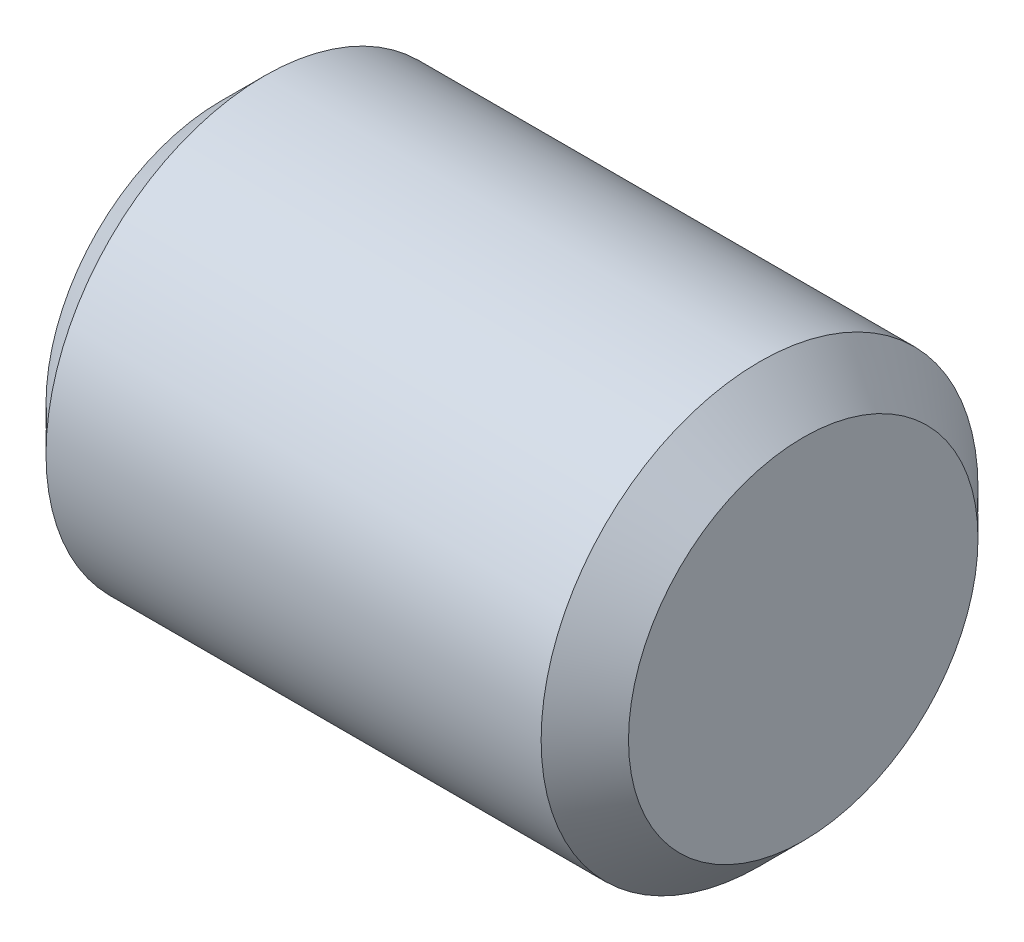
ISO-10303-21;
HEADER;
FILE_DESCRIPTION(('STEP AP214'),'2;1');
FILE_NAME('part.step','',(''),(''),'','','');
FILE_SCHEMA(('AUTOMOTIVE_DESIGN { 1 0 10303 214 1 1 1 1 }'));
ENDSEC;
DATA;
#1=APPLICATION_CONTEXT('core data for automotive mechanical design processes');
#2=APPLICATION_PROTOCOL_DEFINITION('international standard','automotive_design',2000,#1);
#3=PRODUCT_CONTEXT('',#1,'mechanical');
#4=PRODUCT('Part','Part','',(#3));
#5=PRODUCT_RELATED_PRODUCT_CATEGORY('part','',(#4));
#6=PRODUCT_DEFINITION_FORMATION('','',#4);
#7=PRODUCT_DEFINITION_CONTEXT('part definition',#1,'design');
#8=PRODUCT_DEFINITION('design','',#6,#7);
#9=PRODUCT_DEFINITION_SHAPE('','',#8);
#10=(LENGTH_UNIT() NAMED_UNIT(*) SI_UNIT(.MILLI.,.METRE.));
#11=(NAMED_UNIT(*) PLANE_ANGLE_UNIT() SI_UNIT($,.RADIAN.));
#12=(NAMED_UNIT(*) SI_UNIT($,.STERADIAN.) SOLID_ANGLE_UNIT());
#13=UNCERTAINTY_MEASURE_WITH_UNIT(LENGTH_MEASURE(1.E-05),#10,'distance_accuracy_value','');
#14=(GEOMETRIC_REPRESENTATION_CONTEXT(3) GLOBAL_UNCERTAINTY_ASSIGNED_CONTEXT((#13)) GLOBAL_UNIT_ASSIGNED_CONTEXT((#10,
#11,#12)) REPRESENTATION_CONTEXT('',''));
#15=CARTESIAN_POINT('',(0.,0.,0.));
#16=DIRECTION('',(0.,0.,1.));
#17=DIRECTION('',(1.,0.,0.));
#18=AXIS2_PLACEMENT_3D('',#15,#16,#17);
#19=CARTESIAN_POINT('',(-3.175,0.,0.));
#20=DIRECTION('',(1.,0.,0.));
#21=DIRECTION('',(0.,0.,-1.));
#22=AXIS2_PLACEMENT_3D('',#19,#20,#21);
#23=CYLINDRICAL_SURFACE('',#22,2.38125);
#24=CARTESIAN_POINT('',(2.69875,0.,0.));
#25=DIRECTION('',(1.,0.,0.));
#26=DIRECTION('',(0.,0.,-1.));
#27=AXIS2_PLACEMENT_3D('',#24,#25,#26);
#28=CIRCLE('',#27,2.38125);
#29=CARTESIAN_POINT('',(2.69875,0.,2.38125));
#30=VERTEX_POINT('',#29);
#31=EDGE_CURVE('E37',#30,#30,#28,.F.);
#32=ORIENTED_EDGE('',*,*,#31,.T.);
#33=EDGE_LOOP('',(#32));
#34=FACE_BOUND('',#33,.T.);
#35=CARTESIAN_POINT('',(-2.69875,0.,0.));
#36=DIRECTION('',(1.,0.,0.));
#37=DIRECTION('',(0.,0.,-1.));
#38=AXIS2_PLACEMENT_3D('',#35,#36,#37);
#39=CIRCLE('',#38,2.38125);
#40=CARTESIAN_POINT('',(-2.69875,0.,-2.38125));
#41=VERTEX_POINT('',#40);
#42=EDGE_CURVE('E41',#41,#41,#39,.T.);
#43=ORIENTED_EDGE('',*,*,#42,.T.);
#44=EDGE_LOOP('',(#43));
#45=FACE_BOUND('',#44,.T.);
#46=ADVANCED_FACE('F30',(#34,#45),#23,.T.);
#47=CARTESIAN_POINT('',(-3.175,0.,0.));
#48=DIRECTION('',(1.,0.,0.));
#49=DIRECTION('',(0.,0.,-1.));
#50=AXIS2_PLACEMENT_3D('',#47,#48,#49);
#51=PLANE('',#50);
#52=CARTESIAN_POINT('',(-3.175,0.,0.));
#53=DIRECTION('',(1.,0.,0.));
#54=DIRECTION('',(0.,0.,-1.));
#55=AXIS2_PLACEMENT_3D('',#52,#53,#54);
#56=CIRCLE('',#55,1.905);
#57=CARTESIAN_POINT('',(-3.175,0.,-1.905));
#58=VERTEX_POINT('',#57);
#59=EDGE_CURVE('E10',#58,#58,#56,.F.);
#60=ORIENTED_EDGE('',*,*,#59,.T.);
#61=EDGE_LOOP('',(#60));
#62=FACE_BOUND('',#61,.T.);
#63=ADVANCED_FACE('F61',(#62),#51,.F.);
#64=CARTESIAN_POINT('',(3.175,0.,0.));
#65=DIRECTION('',(1.,0.,0.));
#66=DIRECTION('',(0.,0.,-1.));
#67=AXIS2_PLACEMENT_3D('',#64,#65,#66);
#68=PLANE('',#67);
#69=CARTESIAN_POINT('',(3.175,0.,0.));
#70=DIRECTION('',(1.,0.,0.));
#71=DIRECTION('',(0.,0.,-1.));
#72=AXIS2_PLACEMENT_3D('',#69,#70,#71);
#73=CIRCLE('',#72,1.905);
#74=CARTESIAN_POINT('',(3.175,0.,1.905));
#75=VERTEX_POINT('',#74);
#76=EDGE_CURVE('E45',#75,#75,#73,.T.);
#77=ORIENTED_EDGE('',*,*,#76,.T.);
#78=EDGE_LOOP('',(#77));
#79=FACE_BOUND('',#78,.T.);
#80=ADVANCED_FACE('F51',(#79),#68,.T.);
#81=CARTESIAN_POINT('',(3.175,0.,0.));
#82=DIRECTION('',(-1.,0.,0.));
#83=DIRECTION('',(0.,0.,1.));
#84=AXIS2_PLACEMENT_3D('',#81,#82,#83);
#85=CONICAL_SURFACE('',#84,1.905,0.785398163397447);
#86=CARTESIAN_POINT('',(2.69875,0.,2.38125));
#87=CARTESIAN_POINT('',(2.7037109375,0.,2.3762890625));
#88=CARTESIAN_POINT('',(2.708671875,0.,2.371328125));
#89=CARTESIAN_POINT('',(2.71859375,0.,2.36140625));
#90=CARTESIAN_POINT('',(2.7235546875,0.,2.3564453125));
#91=CARTESIAN_POINT('',(2.7334765625,0.,2.3465234375));
#92=CARTESIAN_POINT('',(2.7384375,0.,2.3415625));
#93=CARTESIAN_POINT('',(2.748359375,0.,2.331640625));
#94=CARTESIAN_POINT('',(2.7533203125,0.,2.3266796875));
#95=CARTESIAN_POINT('',(2.7632421875,0.,2.3167578125));
#96=CARTESIAN_POINT('',(2.768203125,0.,2.311796875));
#97=CARTESIAN_POINT('',(2.778125,0.,2.301875));
#98=CARTESIAN_POINT('',(2.7830859375,0.,2.2969140625));
#99=CARTESIAN_POINT('',(2.7930078125,0.,2.2869921875));
#100=CARTESIAN_POINT('',(2.79796875,0.,2.28203125));
#101=CARTESIAN_POINT('',(2.807890625,0.,2.272109375));
#102=CARTESIAN_POINT('',(2.8128515625,0.,2.2671484375));
#103=CARTESIAN_POINT('',(2.8227734375,0.,2.2572265625));
#104=CARTESIAN_POINT('',(2.827734375,0.,2.252265625));
#105=CARTESIAN_POINT('',(2.83765625,0.,2.24234375));
#106=CARTESIAN_POINT('',(2.8426171875,0.,2.2373828125));
#107=CARTESIAN_POINT('',(2.8525390625,0.,2.2274609375));
#108=CARTESIAN_POINT('',(2.8575,0.,2.2225));
#109=CARTESIAN_POINT('',(2.867421875,0.,2.212578125));
#110=CARTESIAN_POINT('',(2.8723828125,0.,2.2076171875));
#111=CARTESIAN_POINT('',(2.8823046875,0.,2.1976953125));
#112=CARTESIAN_POINT('',(2.887265625,0.,2.192734375));
#113=CARTESIAN_POINT('',(2.8971875,0.,2.1828125));
#114=CARTESIAN_POINT('',(2.9021484375,0.,2.1778515625));
#115=CARTESIAN_POINT('',(2.9120703125,0.,2.1679296875));
#116=CARTESIAN_POINT('',(2.91703125,0.,2.16296875));
#117=CARTESIAN_POINT('',(2.926953125,0.,2.153046875));
#118=CARTESIAN_POINT('',(2.9319140625,0.,2.1480859375));
#119=CARTESIAN_POINT('',(2.9418359375,0.,2.1381640625));
#120=CARTESIAN_POINT('',(2.946796875,0.,2.133203125));
#121=CARTESIAN_POINT('',(2.95671875,0.,2.12328125));
#122=CARTESIAN_POINT('',(2.9616796875,0.,2.1183203125));
#123=CARTESIAN_POINT('',(2.9716015625,0.,2.1083984375));
#124=CARTESIAN_POINT('',(2.9765625,0.,2.1034375));
#125=CARTESIAN_POINT('',(2.986484375,0.,2.093515625));
#126=CARTESIAN_POINT('',(2.9914453125,0.,2.0885546875));
#127=CARTESIAN_POINT('',(3.0013671875,0.,2.0786328125));
#128=CARTESIAN_POINT('',(3.006328125,0.,2.073671875));
#129=CARTESIAN_POINT('',(3.01625,0.,2.06375));
#130=CARTESIAN_POINT('',(3.0212109375,0.,2.0587890625));
#131=CARTESIAN_POINT('',(3.0311328125,0.,2.0488671875));
#132=CARTESIAN_POINT('',(3.03609375,0.,2.04390625));
#133=CARTESIAN_POINT('',(3.046015625,0.,2.033984375));
#134=CARTESIAN_POINT('',(3.0509765625,0.,2.0290234375));
#135=CARTESIAN_POINT('',(3.0608984375,0.,2.0191015625));
#136=CARTESIAN_POINT('',(3.065859375,0.,2.014140625));
#137=CARTESIAN_POINT('',(3.07578125,0.,2.00421875));
#138=CARTESIAN_POINT('',(3.0807421875,0.,1.9992578125));
#139=CARTESIAN_POINT('',(3.0906640625,0.,1.9893359375));
#140=CARTESIAN_POINT('',(3.095625,0.,1.984375));
#141=CARTESIAN_POINT('',(3.105546875,0.,1.974453125));
#142=CARTESIAN_POINT('',(3.1105078125,0.,1.9694921875));
#143=CARTESIAN_POINT('',(3.1204296875,0.,1.9595703125));
#144=CARTESIAN_POINT('',(3.125390625,0.,1.954609375));
#145=CARTESIAN_POINT('',(3.1353125,0.,1.9446875));
#146=CARTESIAN_POINT('',(3.1402734375,0.,1.9397265625));
#147=CARTESIAN_POINT('',(3.1501953125,0.,1.9298046875));
#148=CARTESIAN_POINT('',(3.15515625,0.,1.92484375));
#149=CARTESIAN_POINT('',(3.165078125,0.,1.914921875));
#150=CARTESIAN_POINT('',(3.1700390625,0.,1.9099609375));
#151=CARTESIAN_POINT('',(3.175,0.,1.905));
#152=B_SPLINE_CURVE_WITH_KNOTS('',3,(#86,#87,#88,#89,#90,#91,#92,#93,#94,#95,#96,#97,#98,#99,
#100,#101,#102,#103,#104,#105,#106,#107,#108,#109,#110,#111,#112,#113,#114,#115,#116,#117,#118,
#119,#120,#121,#122,#123,#124,#125,#126,#127,#128,#129,#130,#131,#132,#133,#134,#135,#136,#137,
#138,#139,#140,#141,#142,#143,#144,#145,#146,#147,#148,#149,#150,#151),.UNSPECIFIED.,.F.,.F.,(4,
2,2,2,2,2,2,2,2,2,2,2,2,2,2,2,2,2,2,2,2,2,2,2,2,2,2,2,2,2,2,2,4),(0.,0.021047475283756,
0.0420949505675117,0.0631424258512678,0.0841899011350235,0.10523737641878,0.126284851702535,
0.147332326986291,0.168379802270047,0.189427277553803,0.210474752837559,0.231522228121314,
0.25256970340507,0.273617178688826,0.294664653972582,0.315712129256338,0.336759604540094,
0.35780707982385,0.378854555107605,0.399902030391361,0.420949505675117,0.441996980958873,
0.463044456242629,0.484091931526385,0.505139406810141,0.526186882093896,0.547234357377652,
0.568281832661408,0.589329307945164,0.61037678322892,0.631424258512676,0.652471733796432,
0.673519209080188),.UNSPECIFIED.);
#153=EDGE_CURVE('BSEAM53',#30,#75,#152,.T.);
#154=ORIENTED_EDGE('',*,*,#31,.F.);
#155=ORIENTED_EDGE('',*,*,#76,.F.);
#156=ORIENTED_EDGE('',*,*,#153,.T.);
#157=ORIENTED_EDGE('',*,*,#153,.F.);
#158=EDGE_LOOP('',(#154,#156,#155,#157));
#159=FACE_BOUND('',#158,.T.);
#160=ADVANCED_FACE('F53',(#159),#85,.T.);
#161=CARTESIAN_POINT('',(-2.69875,0.,0.));
#162=DIRECTION('',(1.,0.,0.));
#163=DIRECTION('',(0.,0.,-1.));
#164=AXIS2_PLACEMENT_3D('',#161,#162,#163);
#165=CONICAL_SURFACE('',#164,2.38125,0.78539816339745);
#166=ORIENTED_EDGE('',*,*,#59,.F.);
#167=EDGE_LOOP('',(#166));
#168=FACE_BOUND('',#167,.T.);
#169=ORIENTED_EDGE('',*,*,#42,.F.);
#170=EDGE_LOOP('',(#169));
#171=FACE_BOUND('',#170,.T.);
#172=ADVANCED_FACE('F32',(#168,#171),#165,.T.);
#173=CLOSED_SHELL('',(#46,#63,#80,#160,#172));
#174=MANIFOLD_SOLID_BREP('B2',#173);
#175=ADVANCED_BREP_SHAPE_REPRESENTATION('',(#18,#174),#14);
#176=SHAPE_DEFINITION_REPRESENTATION(#9,#175);
ENDSEC;
END-ISO-10303-21;
